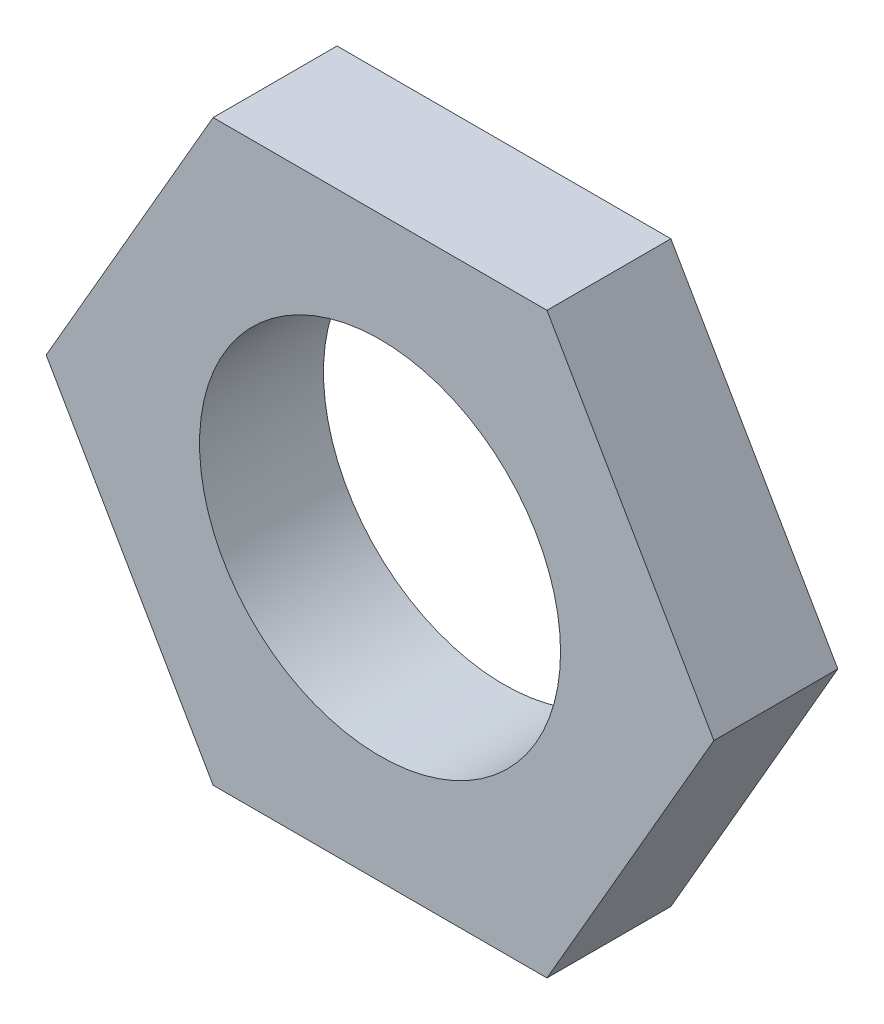
ISO-10303-21;
HEADER;
FILE_DESCRIPTION(('STEP AP214'),'2;1');
FILE_NAME('part.step','',(''),(''),'','','');
FILE_SCHEMA(('AUTOMOTIVE_DESIGN { 1 0 10303 214 1 1 1 1 }'));
ENDSEC;
DATA;
#1=APPLICATION_CONTEXT('core data for automotive mechanical design processes');
#2=APPLICATION_PROTOCOL_DEFINITION('international standard','automotive_design',2000,#1);
#3=PRODUCT_CONTEXT('',#1,'mechanical');
#4=PRODUCT('Part','Part','',(#3));
#5=PRODUCT_RELATED_PRODUCT_CATEGORY('part','',(#4));
#6=PRODUCT_DEFINITION_FORMATION('','',#4);
#7=PRODUCT_DEFINITION_CONTEXT('part definition',#1,'design');
#8=PRODUCT_DEFINITION('design','',#6,#7);
#9=PRODUCT_DEFINITION_SHAPE('','',#8);
#10=(LENGTH_UNIT() NAMED_UNIT(*) SI_UNIT(.MILLI.,.METRE.));
#11=(NAMED_UNIT(*) PLANE_ANGLE_UNIT() SI_UNIT($,.RADIAN.));
#12=(NAMED_UNIT(*) SI_UNIT($,.STERADIAN.) SOLID_ANGLE_UNIT());
#13=UNCERTAINTY_MEASURE_WITH_UNIT(LENGTH_MEASURE(1.E-05),#10,'distance_accuracy_value','');
#14=(GEOMETRIC_REPRESENTATION_CONTEXT(3) GLOBAL_UNCERTAINTY_ASSIGNED_CONTEXT((#13)) GLOBAL_UNIT_ASSIGNED_CONTEXT((#10,
#11,#12)) REPRESENTATION_CONTEXT('',''));
#15=CARTESIAN_POINT('',(0.,0.,0.));
#16=DIRECTION('',(0.,0.,1.));
#17=DIRECTION('',(1.,0.,0.));
#18=AXIS2_PLACEMENT_3D('',#15,#16,#17);
#19=CARTESIAN_POINT('',(0.,0.,1.5));
#20=DIRECTION('',(0.,0.,1.));
#21=DIRECTION('',(1.,0.,0.));
#22=AXIS2_PLACEMENT_3D('',#19,#20,#21);
#23=PLANE('',#22);
#24=DIRECTION('',(0.5,0.866025403784438,0.));
#25=VECTOR('',#24,1.);
#26=CARTESIAN_POINT('',(2.02072594216369,-3.5,1.5));
#27=LINE('',#26,#25);
#28=CARTESIAN_POINT('',(2.02072594216369,-3.5,1.5));
#29=VERTEX_POINT('',#28);
#30=CARTESIAN_POINT('',(4.04145188432738,0.,1.5));
#31=VERTEX_POINT('',#30);
#32=EDGE_CURVE('E129',#29,#31,#27,.T.);
#33=ORIENTED_EDGE('',*,*,#32,.T.);
#34=DIRECTION('',(-0.5,0.866025403784439,0.));
#35=VECTOR('',#34,1.);
#36=CARTESIAN_POINT('',(4.04145188432738,0.,1.5));
#37=LINE('',#36,#35);
#38=CARTESIAN_POINT('',(2.02072594216369,3.5,1.5));
#39=VERTEX_POINT('',#38);
#40=EDGE_CURVE('E87',#31,#39,#37,.T.);
#41=ORIENTED_EDGE('',*,*,#40,.T.);
#42=DIRECTION('',(-1.,0.,0.));
#43=VECTOR('',#42,1.);
#44=CARTESIAN_POINT('',(2.02072594216369,3.5,1.5));
#45=LINE('',#44,#43);
#46=CARTESIAN_POINT('',(-2.02072594216369,3.5,1.5));
#47=VERTEX_POINT('',#46);
#48=EDGE_CURVE('E100',#39,#47,#45,.T.);
#49=ORIENTED_EDGE('',*,*,#48,.T.);
#50=DIRECTION('',(-0.5,-0.866025403784439,0.));
#51=VECTOR('',#50,1.);
#52=CARTESIAN_POINT('',(-2.02072594216369,3.5,1.5));
#53=LINE('',#52,#51);
#54=CARTESIAN_POINT('',(-4.04145188432738,0.,1.5));
#55=VERTEX_POINT('',#54);
#56=EDGE_CURVE('E94',#47,#55,#53,.T.);
#57=ORIENTED_EDGE('',*,*,#56,.T.);
#58=DIRECTION('',(0.5,-0.866025403784439,0.));
#59=VECTOR('',#58,1.);
#60=CARTESIAN_POINT('',(-4.04145188432738,0.,1.5));
#61=LINE('',#60,#59);
#62=CARTESIAN_POINT('',(-2.02072594216369,-3.5,1.5));
#63=VERTEX_POINT('',#62);
#64=EDGE_CURVE('E98',#55,#63,#61,.T.);
#65=ORIENTED_EDGE('',*,*,#64,.T.);
#66=DIRECTION('',(1.,0.,0.));
#67=VECTOR('',#66,1.);
#68=CARTESIAN_POINT('',(-2.02072594216369,-3.5,1.5));
#69=LINE('',#68,#67);
#70=EDGE_CURVE('E50',#63,#29,#69,.T.);
#71=ORIENTED_EDGE('',*,*,#70,.T.);
#72=EDGE_LOOP('',(#33,#41,#49,#57,#65,#71));
#73=FACE_BOUND('',#72,.T.);
#74=CARTESIAN_POINT('',(0.,0.,1.5));
#75=DIRECTION('',(0.,0.,1.));
#76=DIRECTION('',(1.,0.,0.));
#77=AXIS2_PLACEMENT_3D('',#74,#75,#76);
#78=CIRCLE('',#77,2.185);
#79=CARTESIAN_POINT('',(2.185,0.,1.5));
#80=VERTEX_POINT('',#79);
#81=EDGE_CURVE('E122',#80,#80,#78,.T.);
#82=ORIENTED_EDGE('',*,*,#81,.F.);
#83=EDGE_LOOP('',(#82));
#84=FACE_BOUND('',#83,.T.);
#85=ADVANCED_FACE('F33',(#73,#84),#23,.T.);
#86=CARTESIAN_POINT('',(0.,0.,0.));
#87=DIRECTION('',(0.,0.,1.));
#88=DIRECTION('',(1.,0.,0.));
#89=AXIS2_PLACEMENT_3D('',#86,#87,#88);
#90=PLANE('',#89);
#91=DIRECTION('',(0.5,0.866025403784438,0.));
#92=VECTOR('',#91,1.);
#93=CARTESIAN_POINT('',(2.02072594216369,-3.5,0.));
#94=LINE('',#93,#92);
#95=CARTESIAN_POINT('',(2.02072594216369,-3.5,0.));
#96=VERTEX_POINT('',#95);
#97=CARTESIAN_POINT('',(4.04145188432738,0.,0.));
#98=VERTEX_POINT('',#97);
#99=EDGE_CURVE('E118',#96,#98,#94,.T.);
#100=ORIENTED_EDGE('',*,*,#99,.F.);
#101=DIRECTION('',(1.,0.,0.));
#102=VECTOR('',#101,1.);
#103=CARTESIAN_POINT('',(-2.02072594216369,-3.5,0.));
#104=LINE('',#103,#102);
#105=CARTESIAN_POINT('',(-2.02072594216369,-3.5,0.));
#106=VERTEX_POINT('',#105);
#107=EDGE_CURVE('E79',#106,#96,#104,.T.);
#108=ORIENTED_EDGE('',*,*,#107,.F.);
#109=DIRECTION('',(0.5,-0.866025403784439,0.));
#110=VECTOR('',#109,1.);
#111=CARTESIAN_POINT('',(-4.04145188432738,0.,0.));
#112=LINE('',#111,#110);
#113=CARTESIAN_POINT('',(-4.04145188432738,0.,0.));
#114=VERTEX_POINT('',#113);
#115=EDGE_CURVE('E73',#114,#106,#112,.T.);
#116=ORIENTED_EDGE('',*,*,#115,.F.);
#117=DIRECTION('',(-0.5,-0.866025403784439,0.));
#118=VECTOR('',#117,1.);
#119=CARTESIAN_POINT('',(-2.02072594216369,3.5,0.));
#120=LINE('',#119,#118);
#121=CARTESIAN_POINT('',(-2.02072594216369,3.5,0.));
#122=VERTEX_POINT('',#121);
#123=EDGE_CURVE('E108',#122,#114,#120,.T.);
#124=ORIENTED_EDGE('',*,*,#123,.F.);
#125=DIRECTION('',(-1.,0.,0.));
#126=VECTOR('',#125,1.);
#127=CARTESIAN_POINT('',(2.02072594216369,3.5,0.));
#128=LINE('',#127,#126);
#129=CARTESIAN_POINT('',(2.02072594216369,3.5,0.));
#130=VERTEX_POINT('',#129);
#131=EDGE_CURVE('E124',#130,#122,#128,.T.);
#132=ORIENTED_EDGE('',*,*,#131,.F.);
#133=DIRECTION('',(-0.5,0.866025403784439,0.));
#134=VECTOR('',#133,1.);
#135=CARTESIAN_POINT('',(4.04145188432738,0.,0.));
#136=LINE('',#135,#134);
#137=EDGE_CURVE('E121',#98,#130,#136,.T.);
#138=ORIENTED_EDGE('',*,*,#137,.F.);
#139=EDGE_LOOP('',(#100,#108,#116,#124,#132,#138));
#140=FACE_BOUND('',#139,.T.);
#141=CARTESIAN_POINT('',(0.,0.,0.));
#142=DIRECTION('',(0.,0.,1.));
#143=DIRECTION('',(1.,0.,0.));
#144=AXIS2_PLACEMENT_3D('',#141,#142,#143);
#145=CIRCLE('',#144,2.185);
#146=CARTESIAN_POINT('',(2.185,0.,0.));
#147=VERTEX_POINT('',#146);
#148=EDGE_CURVE('E222',#147,#147,#145,.T.);
#149=ORIENTED_EDGE('',*,*,#148,.T.);
#150=EDGE_LOOP('',(#149));
#151=FACE_BOUND('',#150,.T.);
#152=ADVANCED_FACE('F138',(#140,#151),#90,.F.);
#153=CARTESIAN_POINT('',(2.02072594216369,-3.5,1.5));
#154=DIRECTION('',(-0.866025403784439,0.5,0.));
#155=DIRECTION('',(-0.5,-0.866025403784439,0.));
#156=AXIS2_PLACEMENT_3D('',#153,#154,#155);
#157=PLANE('',#156);
#158=ORIENTED_EDGE('',*,*,#99,.T.);
#159=DIRECTION('',(0.,0.,-1.));
#160=VECTOR('',#159,1.);
#161=CARTESIAN_POINT('',(4.04145188432738,0.,1.5));
#162=LINE('',#161,#160);
#163=EDGE_CURVE('E11',#31,#98,#162,.T.);
#164=ORIENTED_EDGE('',*,*,#163,.F.);
#165=ORIENTED_EDGE('',*,*,#32,.F.);
#166=DIRECTION('',(0.,0.,-1.));
#167=VECTOR('',#166,1.);
#168=CARTESIAN_POINT('',(2.02072594216369,-3.5,1.5));
#169=LINE('',#168,#167);
#170=EDGE_CURVE('E114',#29,#96,#169,.T.);
#171=ORIENTED_EDGE('',*,*,#170,.T.);
#172=EDGE_LOOP('',(#158,#164,#165,#171));
#173=FACE_BOUND('',#172,.T.);
#174=ADVANCED_FACE('F35',(#173),#157,.F.);
#175=CARTESIAN_POINT('',(4.04145188432738,0.,1.5));
#176=DIRECTION('',(-0.866025403784438,-0.5,0.));
#177=DIRECTION('',(0.5,-0.866025403784439,0.));
#178=AXIS2_PLACEMENT_3D('',#175,#176,#177);
#179=PLANE('',#178);
#180=ORIENTED_EDGE('',*,*,#137,.T.);
#181=DIRECTION('',(0.,0.,-1.));
#182=VECTOR('',#181,1.);
#183=CARTESIAN_POINT('',(2.02072594216369,3.5,1.5));
#184=LINE('',#183,#182);
#185=EDGE_CURVE('E42',#39,#130,#184,.T.);
#186=ORIENTED_EDGE('',*,*,#185,.F.);
#187=ORIENTED_EDGE('',*,*,#40,.F.);
#188=ORIENTED_EDGE('',*,*,#163,.T.);
#189=EDGE_LOOP('',(#180,#186,#187,#188));
#190=FACE_BOUND('',#189,.T.);
#191=ADVANCED_FACE('F163',(#190),#179,.F.);
#192=CARTESIAN_POINT('',(2.02072594216369,3.5,1.5));
#193=DIRECTION('',(0.,-1.,0.));
#194=DIRECTION('',(1.,0.,0.));
#195=AXIS2_PLACEMENT_3D('',#192,#193,#194);
#196=PLANE('',#195);
#197=ORIENTED_EDGE('',*,*,#131,.T.);
#198=DIRECTION('',(0.,0.,-1.));
#199=VECTOR('',#198,1.);
#200=CARTESIAN_POINT('',(-2.02072594216369,3.5,1.5));
#201=LINE('',#200,#199);
#202=EDGE_CURVE('E109',#47,#122,#201,.T.);
#203=ORIENTED_EDGE('',*,*,#202,.F.);
#204=ORIENTED_EDGE('',*,*,#48,.F.);
#205=ORIENTED_EDGE('',*,*,#185,.T.);
#206=EDGE_LOOP('',(#197,#203,#204,#205));
#207=FACE_BOUND('',#206,.T.);
#208=ADVANCED_FACE('F135',(#207),#196,.F.);
#209=CARTESIAN_POINT('',(-2.02072594216369,3.5,1.5));
#210=DIRECTION('',(0.866025403784439,-0.5,0.));
#211=DIRECTION('',(0.5,0.866025403784439,0.));
#212=AXIS2_PLACEMENT_3D('',#209,#210,#211);
#213=PLANE('',#212);
#214=ORIENTED_EDGE('',*,*,#123,.T.);
#215=DIRECTION('',(0.,0.,-1.));
#216=VECTOR('',#215,1.);
#217=CARTESIAN_POINT('',(-4.04145188432738,0.,1.5));
#218=LINE('',#217,#216);
#219=EDGE_CURVE('E105',#55,#114,#218,.T.);
#220=ORIENTED_EDGE('',*,*,#219,.F.);
#221=ORIENTED_EDGE('',*,*,#56,.F.);
#222=ORIENTED_EDGE('',*,*,#202,.T.);
#223=EDGE_LOOP('',(#214,#220,#221,#222));
#224=FACE_BOUND('',#223,.T.);
#225=ADVANCED_FACE('F106',(#224),#213,.F.);
#226=CARTESIAN_POINT('',(-4.04145188432738,0.,1.5));
#227=DIRECTION('',(0.866025403784439,0.5,0.));
#228=DIRECTION('',(-0.5,0.866025403784439,0.));
#229=AXIS2_PLACEMENT_3D('',#226,#227,#228);
#230=PLANE('',#229);
#231=ORIENTED_EDGE('',*,*,#115,.T.);
#232=DIRECTION('',(0.,0.,-1.));
#233=VECTOR('',#232,1.);
#234=CARTESIAN_POINT('',(-2.02072594216369,-3.5,1.5));
#235=LINE('',#234,#233);
#236=EDGE_CURVE('E110',#63,#106,#235,.T.);
#237=ORIENTED_EDGE('',*,*,#236,.F.);
#238=ORIENTED_EDGE('',*,*,#64,.F.);
#239=ORIENTED_EDGE('',*,*,#219,.T.);
#240=EDGE_LOOP('',(#231,#237,#238,#239));
#241=FACE_BOUND('',#240,.T.);
#242=ADVANCED_FACE('F112',(#241),#230,.F.);
#243=CARTESIAN_POINT('',(-2.02072594216369,-3.5,1.5));
#244=DIRECTION('',(0.,1.,0.));
#245=DIRECTION('',(-1.,0.,0.));
#246=AXIS2_PLACEMENT_3D('',#243,#244,#245);
#247=PLANE('',#246);
#248=ORIENTED_EDGE('',*,*,#107,.T.);
#249=ORIENTED_EDGE('',*,*,#170,.F.);
#250=ORIENTED_EDGE('',*,*,#70,.F.);
#251=ORIENTED_EDGE('',*,*,#236,.T.);
#252=EDGE_LOOP('',(#248,#249,#250,#251));
#253=FACE_BOUND('',#252,.T.);
#254=ADVANCED_FACE('F143',(#253),#247,.F.);
#255=CARTESIAN_POINT('',(0.,0.,1.5));
#256=DIRECTION('',(0.,0.,-1.));
#257=DIRECTION('',(-1.,0.,0.));
#258=AXIS2_PLACEMENT_3D('',#255,#256,#257);
#259=CYLINDRICAL_SURFACE('',#258,2.185);
#260=ORIENTED_EDGE('',*,*,#81,.T.);
#261=EDGE_LOOP('',(#260));
#262=FACE_BOUND('',#261,.T.);
#263=ORIENTED_EDGE('',*,*,#148,.F.);
#264=EDGE_LOOP('',(#263));
#265=FACE_BOUND('',#264,.T.);
#266=ADVANCED_FACE('F145',(#262,#265),#259,.F.);
#267=CLOSED_SHELL('',(#85,#152,#174,#191,#208,#225,#242,#254,#266));
#268=MANIFOLD_SOLID_BREP('B2',#267);
#269=ADVANCED_BREP_SHAPE_REPRESENTATION('',(#18,#268),#14);
#270=SHAPE_DEFINITION_REPRESENTATION(#9,#269);
ENDSEC;
END-ISO-10303-21;
